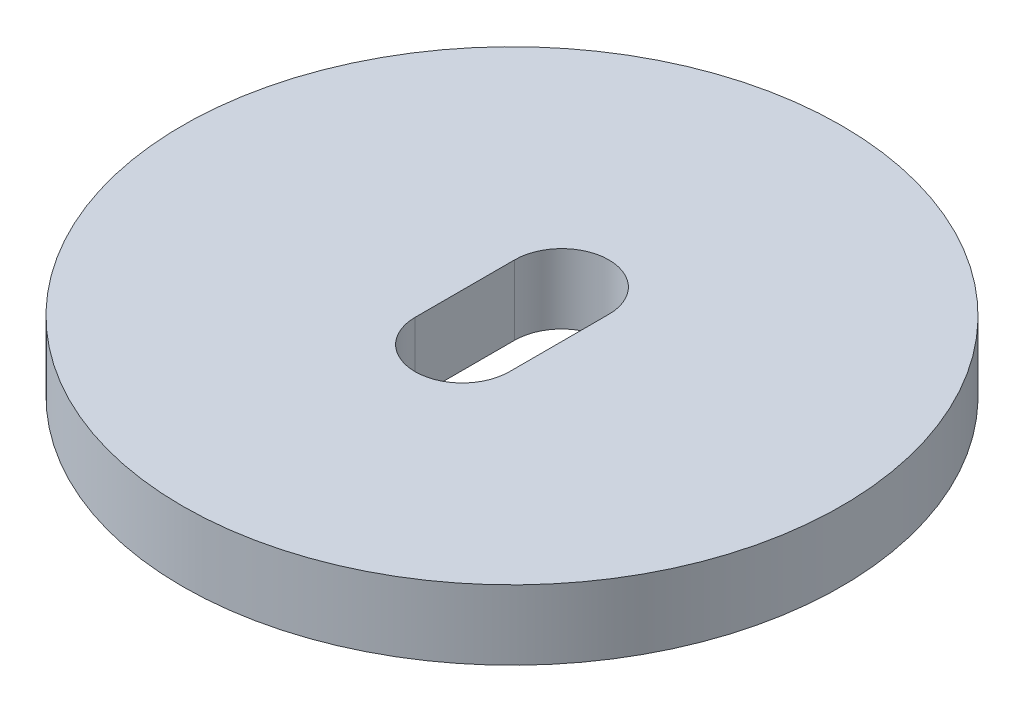
ISO-10303-21;
HEADER;
FILE_DESCRIPTION(('STEP AP214'),'2;1');
FILE_NAME('part.step','',(''),(''),'','','');
FILE_SCHEMA(('AUTOMOTIVE_DESIGN { 1 0 10303 214 1 1 1 1 }'));
ENDSEC;
DATA;
#1=APPLICATION_CONTEXT('core data for automotive mechanical design processes');
#2=APPLICATION_PROTOCOL_DEFINITION('international standard','automotive_design',2000,#1);
#3=PRODUCT_CONTEXT('',#1,'mechanical');
#4=PRODUCT('Part','Part','',(#3));
#5=PRODUCT_RELATED_PRODUCT_CATEGORY('part','',(#4));
#6=PRODUCT_DEFINITION_FORMATION('','',#4);
#7=PRODUCT_DEFINITION_CONTEXT('part definition',#1,'design');
#8=PRODUCT_DEFINITION('design','',#6,#7);
#9=PRODUCT_DEFINITION_SHAPE('','',#8);
#10=(LENGTH_UNIT() NAMED_UNIT(*) SI_UNIT(.MILLI.,.METRE.));
#11=(NAMED_UNIT(*) PLANE_ANGLE_UNIT() SI_UNIT($,.RADIAN.));
#12=(NAMED_UNIT(*) SI_UNIT($,.STERADIAN.) SOLID_ANGLE_UNIT());
#13=UNCERTAINTY_MEASURE_WITH_UNIT(LENGTH_MEASURE(1.E-05),#10,'distance_accuracy_value','');
#14=(GEOMETRIC_REPRESENTATION_CONTEXT(3) GLOBAL_UNCERTAINTY_ASSIGNED_CONTEXT((#13)) GLOBAL_UNIT_ASSIGNED_CONTEXT((#10,
#11,#12)) REPRESENTATION_CONTEXT('',''));
#15=CARTESIAN_POINT('',(0.,0.,0.));
#16=DIRECTION('',(0.,0.,1.));
#17=DIRECTION('',(1.,0.,0.));
#18=AXIS2_PLACEMENT_3D('',#15,#16,#17);
#19=CARTESIAN_POINT('',(0.,2.8,0.));
#20=DIRECTION('',(0.,1.,0.));
#21=DIRECTION('',(0.,0.,1.));
#22=AXIS2_PLACEMENT_3D('',#19,#20,#21);
#23=PLANE('',#22);
#24=CARTESIAN_POINT('',(0.,2.8,0.));
#25=DIRECTION('',(0.,1.,0.));
#26=DIRECTION('',(0.,0.,1.));
#27=AXIS2_PLACEMENT_3D('',#24,#25,#26);
#28=CIRCLE('',#27,13.25);
#29=CARTESIAN_POINT('',(0.,2.8,13.25));
#30=VERTEX_POINT('',#29);
#31=EDGE_CURVE('E11',#30,#30,#28,.T.);
#32=ORIENTED_EDGE('',*,*,#31,.T.);
#33=EDGE_LOOP('',(#32));
#34=FACE_BOUND('',#33,.T.);
#35=DIRECTION('',(0.,0.,-1.));
#36=VECTOR('',#35,1.);
#37=CARTESIAN_POINT('',(1.895,2.8,2.));
#38=LINE('',#37,#36);
#39=CARTESIAN_POINT('',(1.895,2.8,2.));
#40=VERTEX_POINT('',#39);
#41=CARTESIAN_POINT('',(1.895,2.8,-2.));
#42=VERTEX_POINT('',#41);
#43=EDGE_CURVE('E82',#40,#42,#38,.T.);
#44=ORIENTED_EDGE('',*,*,#43,.F.);
#45=CARTESIAN_POINT('',(0.,2.8,2.));
#46=DIRECTION('',(0.,1.,0.));
#47=DIRECTION('',(0.,0.,1.));
#48=AXIS2_PLACEMENT_3D('',#45,#46,#47);
#49=CIRCLE('',#48,1.895);
#50=CARTESIAN_POINT('',(-1.895,2.8,2.));
#51=VERTEX_POINT('',#50);
#52=EDGE_CURVE('E74',#51,#40,#49,.T.);
#53=ORIENTED_EDGE('',*,*,#52,.F.);
#54=DIRECTION('',(0.,0.,1.));
#55=VECTOR('',#54,1.);
#56=CARTESIAN_POINT('',(-1.895,2.8,2.));
#57=LINE('',#56,#55);
#58=CARTESIAN_POINT('',(-1.895,2.8,-2.));
#59=VERTEX_POINT('',#58);
#60=EDGE_CURVE('E95',#59,#51,#57,.T.);
#61=ORIENTED_EDGE('',*,*,#60,.F.);
#62=CARTESIAN_POINT('',(0.,2.8,-2.));
#63=DIRECTION('',(0.,1.,0.));
#64=DIRECTION('',(0.,0.,1.));
#65=AXIS2_PLACEMENT_3D('',#62,#63,#64);
#66=CIRCLE('',#65,1.895);
#67=EDGE_CURVE('E93',#42,#59,#66,.T.);
#68=ORIENTED_EDGE('',*,*,#67,.F.);
#69=EDGE_LOOP('',(#44,#53,#61,#68));
#70=FACE_BOUND('',#69,.T.);
#71=ADVANCED_FACE('F33',(#34,#70),#23,.T.);
#72=CARTESIAN_POINT('',(0.,0.,0.));
#73=DIRECTION('',(0.,1.,0.));
#74=DIRECTION('',(0.,0.,1.));
#75=AXIS2_PLACEMENT_3D('',#72,#73,#74);
#76=PLANE('',#75);
#77=CARTESIAN_POINT('',(0.,0.,0.));
#78=DIRECTION('',(0.,1.,0.));
#79=DIRECTION('',(0.,0.,1.));
#80=AXIS2_PLACEMENT_3D('',#77,#78,#79);
#81=CIRCLE('',#80,13.25);
#82=CARTESIAN_POINT('',(0.,0.,13.25));
#83=VERTEX_POINT('',#82);
#84=EDGE_CURVE('E37',#83,#83,#81,.T.);
#85=ORIENTED_EDGE('',*,*,#84,.F.);
#86=EDGE_LOOP('',(#85));
#87=FACE_BOUND('',#86,.T.);
#88=CARTESIAN_POINT('',(0.,0.,2.));
#89=DIRECTION('',(0.,1.,0.));
#90=DIRECTION('',(0.,0.,1.));
#91=AXIS2_PLACEMENT_3D('',#88,#89,#90);
#92=CIRCLE('',#91,1.895);
#93=CARTESIAN_POINT('',(-1.895,0.,2.));
#94=VERTEX_POINT('',#93);
#95=CARTESIAN_POINT('',(1.895,0.,2.));
#96=VERTEX_POINT('',#95);
#97=EDGE_CURVE('E56',#94,#96,#92,.T.);
#98=ORIENTED_EDGE('',*,*,#97,.T.);
#99=DIRECTION('',(0.,0.,-1.));
#100=VECTOR('',#99,1.);
#101=CARTESIAN_POINT('',(1.895,0.,2.));
#102=LINE('',#101,#100);
#103=CARTESIAN_POINT('',(1.895,0.,-2.));
#104=VERTEX_POINT('',#103);
#105=EDGE_CURVE('E89',#96,#104,#102,.T.);
#106=ORIENTED_EDGE('',*,*,#105,.T.);
#107=CARTESIAN_POINT('',(0.,0.,-2.));
#108=DIRECTION('',(0.,1.,0.));
#109=DIRECTION('',(0.,0.,1.));
#110=AXIS2_PLACEMENT_3D('',#107,#108,#109);
#111=CIRCLE('',#110,1.895);
#112=CARTESIAN_POINT('',(-1.895,0.,-2.));
#113=VERTEX_POINT('',#112);
#114=EDGE_CURVE('E101',#104,#113,#111,.T.);
#115=ORIENTED_EDGE('',*,*,#114,.T.);
#116=DIRECTION('',(0.,0.,1.));
#117=VECTOR('',#116,1.);
#118=CARTESIAN_POINT('',(-1.895,0.,2.));
#119=LINE('',#118,#117);
#120=EDGE_CURVE('E83',#113,#94,#119,.T.);
#121=ORIENTED_EDGE('',*,*,#120,.T.);
#122=EDGE_LOOP('',(#98,#106,#115,#121));
#123=FACE_BOUND('',#122,.T.);
#124=ADVANCED_FACE('F112',(#87,#123),#76,.F.);
#125=CARTESIAN_POINT('',(0.,2.8,0.));
#126=DIRECTION('',(0.,-1.,0.));
#127=DIRECTION('',(0.,0.,-1.));
#128=AXIS2_PLACEMENT_3D('',#125,#126,#127);
#129=CYLINDRICAL_SURFACE('',#128,13.25);
#130=ORIENTED_EDGE('',*,*,#31,.F.);
#131=EDGE_LOOP('',(#130));
#132=FACE_BOUND('',#131,.T.);
#133=ORIENTED_EDGE('',*,*,#84,.T.);
#134=EDGE_LOOP('',(#133));
#135=FACE_BOUND('',#134,.T.);
#136=ADVANCED_FACE('F35',(#132,#135),#129,.T.);
#137=CARTESIAN_POINT('',(0.,2.8,2.));
#138=DIRECTION('',(0.,-1.,0.));
#139=DIRECTION('',(0.,0.,-1.));
#140=AXIS2_PLACEMENT_3D('',#137,#138,#139);
#141=CYLINDRICAL_SURFACE('',#140,1.895);
#142=ORIENTED_EDGE('',*,*,#97,.F.);
#143=DIRECTION('',(0.,-1.,0.));
#144=VECTOR('',#143,1.);
#145=CARTESIAN_POINT('',(-1.895,2.8,2.));
#146=LINE('',#145,#144);
#147=EDGE_CURVE('E78',#51,#94,#146,.T.);
#148=ORIENTED_EDGE('',*,*,#147,.F.);
#149=ORIENTED_EDGE('',*,*,#52,.T.);
#150=DIRECTION('',(0.,-1.,0.));
#151=VECTOR('',#150,1.);
#152=CARTESIAN_POINT('',(1.895,2.8,2.));
#153=LINE('',#152,#151);
#154=EDGE_CURVE('E77',#40,#96,#153,.T.);
#155=ORIENTED_EDGE('',*,*,#154,.T.);
#156=EDGE_LOOP('',(#142,#148,#149,#155));
#157=FACE_BOUND('',#156,.T.);
#158=ADVANCED_FACE('F76',(#157),#141,.F.);
#159=CARTESIAN_POINT('',(1.895,2.8,2.));
#160=DIRECTION('',(-1.,0.,0.));
#161=DIRECTION('',(0.,0.,1.));
#162=AXIS2_PLACEMENT_3D('',#159,#160,#161);
#163=PLANE('',#162);
#164=ORIENTED_EDGE('',*,*,#105,.F.);
#165=ORIENTED_EDGE('',*,*,#154,.F.);
#166=ORIENTED_EDGE('',*,*,#43,.T.);
#167=DIRECTION('',(0.,-1.,0.));
#168=VECTOR('',#167,1.);
#169=CARTESIAN_POINT('',(1.895,2.8,-2.));
#170=LINE('',#169,#168);
#171=EDGE_CURVE('E90',#42,#104,#170,.T.);
#172=ORIENTED_EDGE('',*,*,#171,.T.);
#173=EDGE_LOOP('',(#164,#165,#166,#172));
#174=FACE_BOUND('',#173,.T.);
#175=ADVANCED_FACE('F86',(#174),#163,.T.);
#176=CARTESIAN_POINT('',(0.,2.8,-2.));
#177=DIRECTION('',(0.,-1.,0.));
#178=DIRECTION('',(0.,0.,-1.));
#179=AXIS2_PLACEMENT_3D('',#176,#177,#178);
#180=CYLINDRICAL_SURFACE('',#179,1.895);
#181=ORIENTED_EDGE('',*,*,#114,.F.);
#182=ORIENTED_EDGE('',*,*,#171,.F.);
#183=ORIENTED_EDGE('',*,*,#67,.T.);
#184=DIRECTION('',(0.,-1.,0.));
#185=VECTOR('',#184,1.);
#186=CARTESIAN_POINT('',(-1.895,2.8,-2.));
#187=LINE('',#186,#185);
#188=EDGE_CURVE('E48',#59,#113,#187,.T.);
#189=ORIENTED_EDGE('',*,*,#188,.T.);
#190=EDGE_LOOP('',(#181,#182,#183,#189));
#191=FACE_BOUND('',#190,.T.);
#192=ADVANCED_FACE('F110',(#191),#180,.F.);
#193=CARTESIAN_POINT('',(-1.895,2.8,2.));
#194=DIRECTION('',(1.,0.,0.));
#195=DIRECTION('',(0.,0.,-1.));
#196=AXIS2_PLACEMENT_3D('',#193,#194,#195);
#197=PLANE('',#196);
#198=ORIENTED_EDGE('',*,*,#120,.F.);
#199=ORIENTED_EDGE('',*,*,#188,.F.);
#200=ORIENTED_EDGE('',*,*,#60,.T.);
#201=ORIENTED_EDGE('',*,*,#147,.T.);
#202=EDGE_LOOP('',(#198,#199,#200,#201));
#203=FACE_BOUND('',#202,.T.);
#204=ADVANCED_FACE('F113',(#203),#197,.T.);
#205=CLOSED_SHELL('',(#71,#124,#136,#158,#175,#192,#204));
#206=MANIFOLD_SOLID_BREP('B2',#205);
#207=ADVANCED_BREP_SHAPE_REPRESENTATION('',(#18,#206),#14);
#208=SHAPE_DEFINITION_REPRESENTATION(#9,#207);
ENDSEC;
END-ISO-10303-21;
